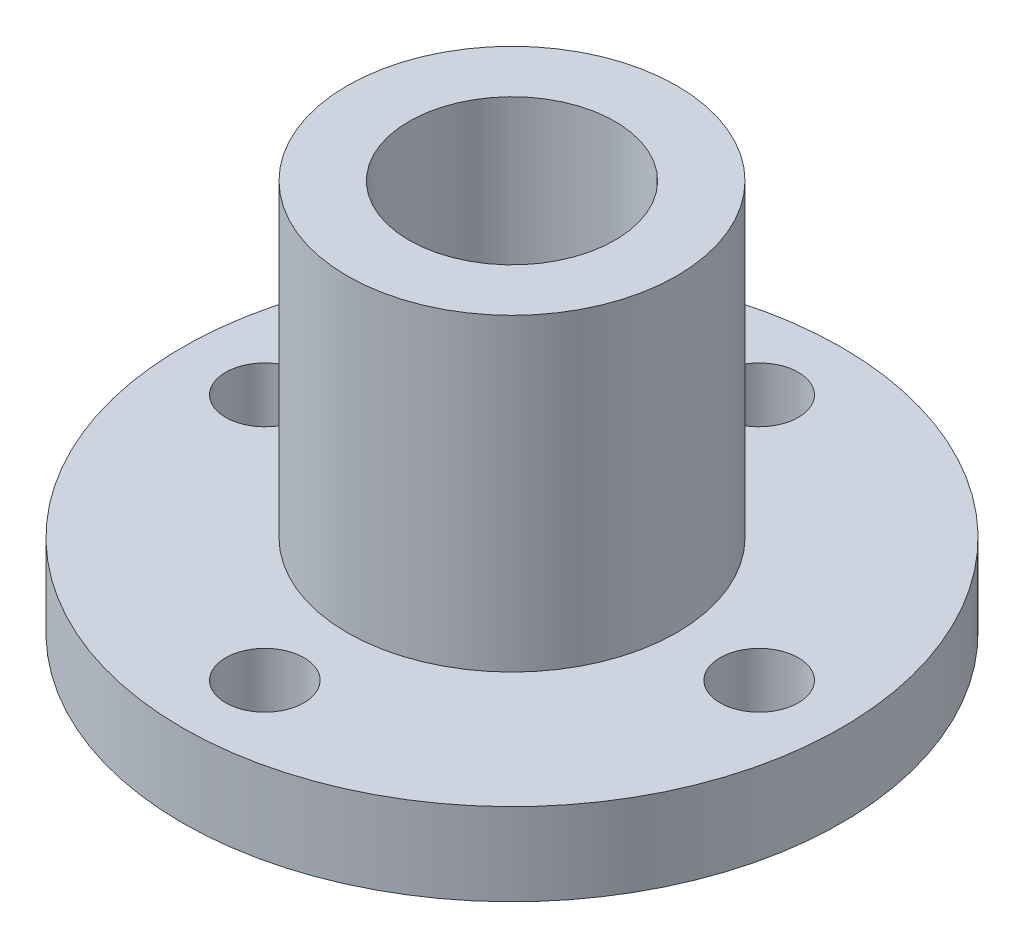
ISO-10303-21;
HEADER;
FILE_DESCRIPTION(('STEP AP214'),'2;1');
FILE_NAME('part.step','',(''),(''),'','','');
FILE_SCHEMA(('AUTOMOTIVE_DESIGN { 1 0 10303 214 1 1 1 1 }'));
ENDSEC;
DATA;
#1=APPLICATION_CONTEXT('core data for automotive mechanical design processes');
#2=APPLICATION_PROTOCOL_DEFINITION('international standard','automotive_design',2000,#1);
#3=PRODUCT_CONTEXT('',#1,'mechanical');
#4=PRODUCT('Part','Part','',(#3));
#5=PRODUCT_RELATED_PRODUCT_CATEGORY('part','',(#4));
#6=PRODUCT_DEFINITION_FORMATION('','',#4);
#7=PRODUCT_DEFINITION_CONTEXT('part definition',#1,'design');
#8=PRODUCT_DEFINITION('design','',#6,#7);
#9=PRODUCT_DEFINITION_SHAPE('','',#8);
#10=(LENGTH_UNIT() NAMED_UNIT(*) SI_UNIT(.MILLI.,.METRE.));
#11=(NAMED_UNIT(*) PLANE_ANGLE_UNIT() SI_UNIT($,.RADIAN.));
#12=(NAMED_UNIT(*) SI_UNIT($,.STERADIAN.) SOLID_ANGLE_UNIT());
#13=UNCERTAINTY_MEASURE_WITH_UNIT(LENGTH_MEASURE(1.E-05),#10,'distance_accuracy_value','');
#14=(GEOMETRIC_REPRESENTATION_CONTEXT(3) GLOBAL_UNCERTAINTY_ASSIGNED_CONTEXT((#13)) GLOBAL_UNIT_ASSIGNED_CONTEXT((#10,
#11,#12)) REPRESENTATION_CONTEXT('',''));
#15=CARTESIAN_POINT('',(0.,0.,0.));
#16=DIRECTION('',(0.,0.,1.));
#17=DIRECTION('',(1.,0.,0.));
#18=AXIS2_PLACEMENT_3D('',#15,#16,#17);
#19=CARTESIAN_POINT('',(0.,4.,0.));
#20=DIRECTION('',(0.,-1.,0.));
#21=DIRECTION('',(0.,0.,-1.));
#22=AXIS2_PLACEMENT_3D('',#19,#20,#21);
#23=CYLINDRICAL_SURFACE('',#22,16.);
#24=CARTESIAN_POINT('',(0.,4.,0.));
#25=DIRECTION('',(0.,1.,0.));
#26=DIRECTION('',(0.,0.,1.));
#27=AXIS2_PLACEMENT_3D('',#24,#25,#26);
#28=CIRCLE('',#27,16.);
#29=CARTESIAN_POINT('',(0.,4.,16.));
#30=VERTEX_POINT('',#29);
#31=EDGE_CURVE('E10',#30,#30,#28,.T.);
#32=ORIENTED_EDGE('',*,*,#31,.F.);
#33=EDGE_LOOP('',(#32));
#34=FACE_BOUND('',#33,.T.);
#35=CARTESIAN_POINT('',(0.,0.,0.));
#36=DIRECTION('',(0.,1.,0.));
#37=DIRECTION('',(0.,0.,1.));
#38=AXIS2_PLACEMENT_3D('',#35,#36,#37);
#39=CIRCLE('',#38,16.);
#40=CARTESIAN_POINT('',(0.,0.,16.));
#41=VERTEX_POINT('',#40);
#42=EDGE_CURVE('E40',#41,#41,#39,.T.);
#43=ORIENTED_EDGE('',*,*,#42,.T.);
#44=EDGE_LOOP('',(#43));
#45=FACE_BOUND('',#44,.T.);
#46=ADVANCED_FACE('F37',(#34,#45),#23,.T.);
#47=CARTESIAN_POINT('',(0.,4.,0.));
#48=DIRECTION('',(0.,1.,0.));
#49=DIRECTION('',(0.,0.,1.));
#50=AXIS2_PLACEMENT_3D('',#47,#48,#49);
#51=PLANE('',#50);
#52=CARTESIAN_POINT('',(0.,4.,-12.));
#53=DIRECTION('',(0.,1.,0.));
#54=DIRECTION('',(0.,0.,1.));
#55=AXIS2_PLACEMENT_3D('',#52,#53,#54);
#56=CIRCLE('',#55,1.9);
#57=CARTESIAN_POINT('',(0.,4.,-10.1));
#58=VERTEX_POINT('',#57);
#59=EDGE_CURVE('E66',#58,#58,#56,.T.);
#60=ORIENTED_EDGE('',*,*,#59,.F.);
#61=EDGE_LOOP('',(#60));
#62=FACE_BOUND('',#61,.T.);
#63=CARTESIAN_POINT('',(12.,4.,0.));
#64=DIRECTION('',(0.,1.,0.));
#65=DIRECTION('',(0.,0.,1.));
#66=AXIS2_PLACEMENT_3D('',#63,#64,#65);
#67=CIRCLE('',#66,1.9);
#68=CARTESIAN_POINT('',(12.,4.,1.9));
#69=VERTEX_POINT('',#68);
#70=EDGE_CURVE('E77',#69,#69,#67,.T.);
#71=ORIENTED_EDGE('',*,*,#70,.F.);
#72=EDGE_LOOP('',(#71));
#73=FACE_BOUND('',#72,.T.);
#74=CARTESIAN_POINT('',(-1.25693328198353E-13,4.,12.));
#75=DIRECTION('',(0.,1.,0.));
#76=DIRECTION('',(0.,0.,1.));
#77=AXIS2_PLACEMENT_3D('',#74,#75,#76);
#78=CIRCLE('',#77,1.9);
#79=CARTESIAN_POINT('',(-1.25693328198353E-13,4.,13.9));
#80=VERTEX_POINT('',#79);
#81=EDGE_CURVE('E67',#80,#80,#78,.T.);
#82=ORIENTED_EDGE('',*,*,#81,.F.);
#83=EDGE_LOOP('',(#82));
#84=FACE_BOUND('',#83,.T.);
#85=CARTESIAN_POINT('',(-12.,4.,0.));
#86=DIRECTION('',(0.,1.,0.));
#87=DIRECTION('',(0.,0.,1.));
#88=AXIS2_PLACEMENT_3D('',#85,#86,#87);
#89=CIRCLE('',#88,1.9);
#90=CARTESIAN_POINT('',(-12.,4.,1.9));
#91=VERTEX_POINT('',#90);
#92=EDGE_CURVE('E58',#91,#91,#89,.T.);
#93=ORIENTED_EDGE('',*,*,#92,.F.);
#94=EDGE_LOOP('',(#93));
#95=FACE_BOUND('',#94,.T.);
#96=CARTESIAN_POINT('',(0.,4.,0.));
#97=DIRECTION('',(0.,1.,0.));
#98=DIRECTION('',(0.,0.,1.));
#99=AXIS2_PLACEMENT_3D('',#96,#97,#98);
#100=CIRCLE('',#99,8.);
#101=CARTESIAN_POINT('',(0.,4.,8.));
#102=VERTEX_POINT('',#101);
#103=EDGE_CURVE('E49',#102,#102,#100,.F.);
#104=ORIENTED_EDGE('',*,*,#103,.T.);
#105=EDGE_LOOP('',(#104));
#106=FACE_BOUND('',#105,.T.);
#107=ORIENTED_EDGE('',*,*,#31,.T.);
#108=EDGE_LOOP('',(#107));
#109=FACE_BOUND('',#108,.T.);
#110=ADVANCED_FACE('F114',(#62,#73,#84,#95,#106,#109),#51,.T.);
#111=CARTESIAN_POINT('',(0.,0.,0.));
#112=DIRECTION('',(0.,1.,0.));
#113=DIRECTION('',(0.,0.,1.));
#114=AXIS2_PLACEMENT_3D('',#111,#112,#113);
#115=PLANE('',#114);
#116=CARTESIAN_POINT('',(0.,0.,0.));
#117=DIRECTION('',(0.,1.,0.));
#118=DIRECTION('',(0.,0.,1.));
#119=AXIS2_PLACEMENT_3D('',#116,#117,#118);
#120=CIRCLE('',#119,5.);
#121=CARTESIAN_POINT('',(0.,0.,5.));
#122=VERTEX_POINT('',#121);
#123=EDGE_CURVE('E94',#122,#122,#120,.T.);
#124=ORIENTED_EDGE('',*,*,#123,.T.);
#125=EDGE_LOOP('',(#124));
#126=FACE_BOUND('',#125,.T.);
#127=CARTESIAN_POINT('',(0.,0.,-12.));
#128=DIRECTION('',(0.,1.,0.));
#129=DIRECTION('',(-1.,0.,0.));
#130=AXIS2_PLACEMENT_3D('',#127,#128,#129);
#131=CIRCLE('',#130,1.9);
#132=CARTESIAN_POINT('',(-1.89999999999996,0.,-12.));
#133=VERTEX_POINT('',#132);
#134=EDGE_CURVE('E81',#133,#133,#131,.T.);
#135=ORIENTED_EDGE('',*,*,#134,.T.);
#136=EDGE_LOOP('',(#135));
#137=FACE_BOUND('',#136,.T.);
#138=CARTESIAN_POINT('',(12.,0.,0.));
#139=DIRECTION('',(0.,1.,0.));
#140=DIRECTION('',(0.,0.,-1.));
#141=AXIS2_PLACEMENT_3D('',#138,#139,#140);
#142=CIRCLE('',#141,1.9);
#143=CARTESIAN_POINT('',(12.,0.,-1.9));
#144=VERTEX_POINT('',#143);
#145=EDGE_CURVE('E71',#144,#144,#142,.T.);
#146=ORIENTED_EDGE('',*,*,#145,.T.);
#147=EDGE_LOOP('',(#146));
#148=FACE_BOUND('',#147,.T.);
#149=CARTESIAN_POINT('',(-1.25693328198353E-13,0.,12.));
#150=DIRECTION('',(0.,1.,0.));
#151=DIRECTION('',(1.,0.,0.));
#152=AXIS2_PLACEMENT_3D('',#149,#150,#151);
#153=CIRCLE('',#152,1.9);
#154=CARTESIAN_POINT('',(1.89999999999987,0.,12.));
#155=VERTEX_POINT('',#154);
#156=EDGE_CURVE('E72',#155,#155,#153,.T.);
#157=ORIENTED_EDGE('',*,*,#156,.T.);
#158=EDGE_LOOP('',(#157));
#159=FACE_BOUND('',#158,.T.);
#160=CARTESIAN_POINT('',(-12.,0.,0.));
#161=DIRECTION('',(0.,1.,0.));
#162=DIRECTION('',(0.,0.,1.));
#163=AXIS2_PLACEMENT_3D('',#160,#161,#162);
#164=CIRCLE('',#163,1.9);
#165=CARTESIAN_POINT('',(-12.,0.,1.9));
#166=VERTEX_POINT('',#165);
#167=EDGE_CURVE('E62',#166,#166,#164,.T.);
#168=ORIENTED_EDGE('',*,*,#167,.T.);
#169=EDGE_LOOP('',(#168));
#170=FACE_BOUND('',#169,.T.);
#171=ORIENTED_EDGE('',*,*,#42,.F.);
#172=EDGE_LOOP('',(#171));
#173=FACE_BOUND('',#172,.T.);
#174=ADVANCED_FACE('F99',(#126,#137,#148,#159,#170,#173),#115,.F.);
#175=CARTESIAN_POINT('',(0.,19.,0.));
#176=DIRECTION('',(0.,-1.,0.));
#177=DIRECTION('',(0.,0.,-1.));
#178=AXIS2_PLACEMENT_3D('',#175,#176,#177);
#179=CYLINDRICAL_SURFACE('',#178,8.);
#180=ORIENTED_EDGE('',*,*,#103,.F.);
#181=EDGE_LOOP('',(#180));
#182=FACE_BOUND('',#181,.T.);
#183=CARTESIAN_POINT('',(0.,19.,0.));
#184=DIRECTION('',(0.,1.,0.));
#185=DIRECTION('',(0.,0.,1.));
#186=AXIS2_PLACEMENT_3D('',#183,#184,#185);
#187=CIRCLE('',#186,8.);
#188=CARTESIAN_POINT('',(0.,19.,8.));
#189=VERTEX_POINT('',#188);
#190=EDGE_CURVE('E54',#189,#189,#187,.T.);
#191=ORIENTED_EDGE('',*,*,#190,.F.);
#192=EDGE_LOOP('',(#191));
#193=FACE_BOUND('',#192,.T.);
#194=ADVANCED_FACE('F125',(#182,#193),#179,.T.);
#195=CARTESIAN_POINT('',(0.,19.,0.));
#196=DIRECTION('',(0.,1.,0.));
#197=DIRECTION('',(0.,0.,1.));
#198=AXIS2_PLACEMENT_3D('',#195,#196,#197);
#199=PLANE('',#198);
#200=CARTESIAN_POINT('',(0.,19.,0.));
#201=DIRECTION('',(0.,1.,0.));
#202=DIRECTION('',(0.,0.,1.));
#203=AXIS2_PLACEMENT_3D('',#200,#201,#202);
#204=CIRCLE('',#203,5.);
#205=CARTESIAN_POINT('',(0.,19.,5.));
#206=VERTEX_POINT('',#205);
#207=EDGE_CURVE('E76',#206,#206,#204,.T.);
#208=ORIENTED_EDGE('',*,*,#207,.F.);
#209=EDGE_LOOP('',(#208));
#210=FACE_BOUND('',#209,.T.);
#211=ORIENTED_EDGE('',*,*,#190,.T.);
#212=EDGE_LOOP('',(#211));
#213=FACE_BOUND('',#212,.T.);
#214=ADVANCED_FACE('F129',(#210,#213),#199,.T.);
#215=CARTESIAN_POINT('',(-12.,19.001,0.));
#216=DIRECTION('',(0.,-1.,0.));
#217=DIRECTION('',(0.,0.,-1.));
#218=AXIS2_PLACEMENT_3D('',#215,#216,#217);
#219=CYLINDRICAL_SURFACE('',#218,1.9);
#220=ORIENTED_EDGE('',*,*,#92,.T.);
#221=EDGE_LOOP('',(#220));
#222=FACE_BOUND('',#221,.T.);
#223=ORIENTED_EDGE('',*,*,#167,.F.);
#224=EDGE_LOOP('',(#223));
#225=FACE_BOUND('',#224,.T.);
#226=ADVANCED_FACE('F135',(#222,#225),#219,.F.);
#227=CARTESIAN_POINT('',(-1.25693328198353E-13,19.001,12.));
#228=DIRECTION('',(0.,-1.,0.));
#229=DIRECTION('',(0.,0.,-1.));
#230=AXIS2_PLACEMENT_3D('',#227,#228,#229);
#231=CYLINDRICAL_SURFACE('',#230,1.9);
#232=ORIENTED_EDGE('',*,*,#81,.T.);
#233=EDGE_LOOP('',(#232));
#234=FACE_BOUND('',#233,.T.);
#235=ORIENTED_EDGE('',*,*,#156,.F.);
#236=EDGE_LOOP('',(#235));
#237=FACE_BOUND('',#236,.T.);
#238=ADVANCED_FACE('F139',(#234,#237),#231,.F.);
#239=CARTESIAN_POINT('',(12.,19.001,0.));
#240=DIRECTION('',(0.,-1.,0.));
#241=DIRECTION('',(0.,0.,-1.));
#242=AXIS2_PLACEMENT_3D('',#239,#240,#241);
#243=CYLINDRICAL_SURFACE('',#242,1.9);
#244=ORIENTED_EDGE('',*,*,#70,.T.);
#245=EDGE_LOOP('',(#244));
#246=FACE_BOUND('',#245,.T.);
#247=ORIENTED_EDGE('',*,*,#145,.F.);
#248=EDGE_LOOP('',(#247));
#249=FACE_BOUND('',#248,.T.);
#250=ADVANCED_FACE('F110',(#246,#249),#243,.F.);
#251=CARTESIAN_POINT('',(0.,19.001,-12.));
#252=DIRECTION('',(0.,-1.,0.));
#253=DIRECTION('',(0.,0.,-1.));
#254=AXIS2_PLACEMENT_3D('',#251,#252,#253);
#255=CYLINDRICAL_SURFACE('',#254,1.9);
#256=ORIENTED_EDGE('',*,*,#59,.T.);
#257=EDGE_LOOP('',(#256));
#258=FACE_BOUND('',#257,.T.);
#259=ORIENTED_EDGE('',*,*,#134,.F.);
#260=EDGE_LOOP('',(#259));
#261=FACE_BOUND('',#260,.T.);
#262=ADVANCED_FACE('F104',(#258,#261),#255,.F.);
#263=CARTESIAN_POINT('',(0.,19.001,0.));
#264=DIRECTION('',(0.,-1.,0.));
#265=DIRECTION('',(0.,0.,-1.));
#266=AXIS2_PLACEMENT_3D('',#263,#264,#265);
#267=CYLINDRICAL_SURFACE('',#266,5.);
#268=ORIENTED_EDGE('',*,*,#207,.T.);
#269=EDGE_LOOP('',(#268));
#270=FACE_BOUND('',#269,.T.);
#271=ORIENTED_EDGE('',*,*,#123,.F.);
#272=EDGE_LOOP('',(#271));
#273=FACE_BOUND('',#272,.T.);
#274=ADVANCED_FACE('F102',(#270,#273),#267,.F.);
#275=CLOSED_SHELL('',(#46,#110,#174,#194,#214,#226,#238,#250,#262,#274));
#276=MANIFOLD_SOLID_BREP('B2',#275);
#277=ADVANCED_BREP_SHAPE_REPRESENTATION('',(#18,#276),#14);
#278=SHAPE_DEFINITION_REPRESENTATION(#9,#277);
ENDSEC;
END-ISO-10303-21;
